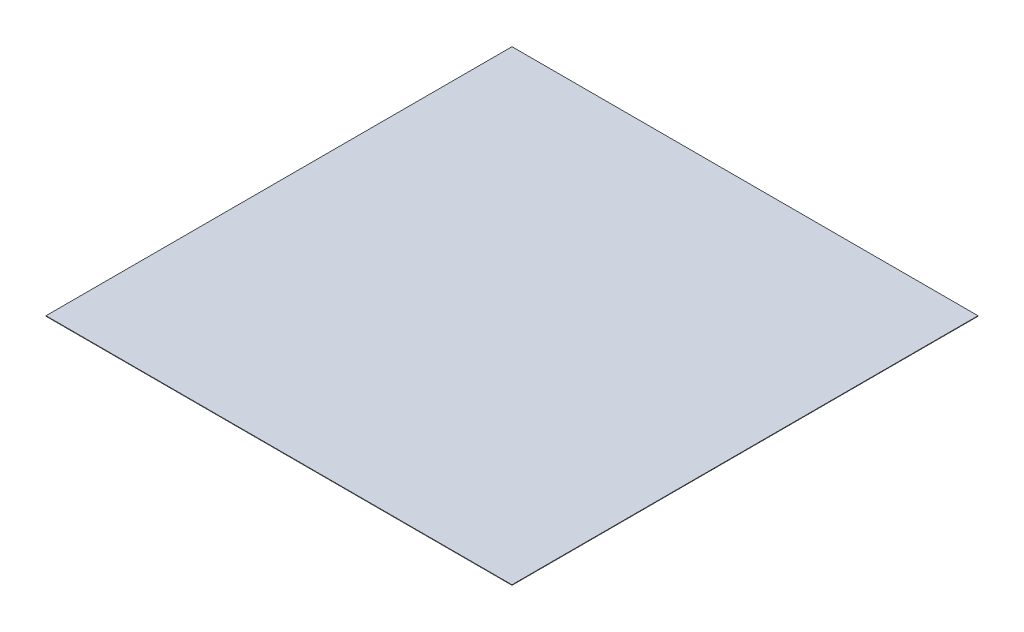
ISO-10303-21;
HEADER;
FILE_DESCRIPTION(('STEP AP214'),'2;1');
FILE_NAME('part.step','',(''),(''),'','','');
FILE_SCHEMA(('AUTOMOTIVE_DESIGN { 1 0 10303 214 1 1 1 1 }'));
ENDSEC;
DATA;
#1=APPLICATION_CONTEXT('core data for automotive mechanical design processes');
#2=APPLICATION_PROTOCOL_DEFINITION('international standard','automotive_design',2000,#1);
#3=PRODUCT_CONTEXT('',#1,'mechanical');
#4=PRODUCT('Part','Part','',(#3));
#5=PRODUCT_RELATED_PRODUCT_CATEGORY('part','',(#4));
#6=PRODUCT_DEFINITION_FORMATION('','',#4);
#7=PRODUCT_DEFINITION_CONTEXT('part definition',#1,'design');
#8=PRODUCT_DEFINITION('design','',#6,#7);
#9=PRODUCT_DEFINITION_SHAPE('','',#8);
#10=(LENGTH_UNIT() NAMED_UNIT(*) SI_UNIT(.MILLI.,.METRE.));
#11=(NAMED_UNIT(*) PLANE_ANGLE_UNIT() SI_UNIT($,.RADIAN.));
#12=(NAMED_UNIT(*) SI_UNIT($,.STERADIAN.) SOLID_ANGLE_UNIT());
#13=UNCERTAINTY_MEASURE_WITH_UNIT(LENGTH_MEASURE(1.E-05),#10,'distance_accuracy_value','');
#14=(GEOMETRIC_REPRESENTATION_CONTEXT(3) GLOBAL_UNCERTAINTY_ASSIGNED_CONTEXT((#13)) GLOBAL_UNIT_ASSIGNED_CONTEXT((#10,
#11,#12)) REPRESENTATION_CONTEXT('',''));
#15=CARTESIAN_POINT('',(0.,0.,0.));
#16=DIRECTION('',(0.,0.,1.));
#17=DIRECTION('',(1.,0.,0.));
#18=AXIS2_PLACEMENT_3D('',#15,#16,#17);
#19=CARTESIAN_POINT('',(620.,1.27,620.));
#20=DIRECTION('',(-1.,0.,0.));
#21=DIRECTION('',(0.,0.,1.));
#22=AXIS2_PLACEMENT_3D('',#19,#20,#21);
#23=PLANE('',#22);
#24=DIRECTION('',(0.,0.,-1.));
#25=VECTOR('',#24,1.);
#26=CARTESIAN_POINT('',(620.,0.,620.));
#27=LINE('',#26,#25);
#28=CARTESIAN_POINT('',(620.,0.,620.));
#29=VERTEX_POINT('',#28);
#30=CARTESIAN_POINT('',(620.,0.,-620.));
#31=VERTEX_POINT('',#30);
#32=EDGE_CURVE('E98',#29,#31,#27,.T.);
#33=ORIENTED_EDGE('',*,*,#32,.T.);
#34=DIRECTION('',(0.,-1.,0.));
#35=VECTOR('',#34,1.);
#36=CARTESIAN_POINT('',(620.,1.27,-620.));
#37=LINE('',#36,#35);
#38=CARTESIAN_POINT('',(620.,1.27,-620.));
#39=VERTEX_POINT('',#38);
#40=EDGE_CURVE('E11',#39,#31,#37,.T.);
#41=ORIENTED_EDGE('',*,*,#40,.F.);
#42=DIRECTION('',(0.,0.,-1.));
#43=VECTOR('',#42,1.);
#44=CARTESIAN_POINT('',(620.,1.27,620.));
#45=LINE('',#44,#43);
#46=CARTESIAN_POINT('',(620.,1.27,620.));
#47=VERTEX_POINT('',#46);
#48=EDGE_CURVE('E86',#47,#39,#45,.T.);
#49=ORIENTED_EDGE('',*,*,#48,.F.);
#50=DIRECTION('',(0.,-1.,0.));
#51=VECTOR('',#50,1.);
#52=CARTESIAN_POINT('',(620.,1.27,620.));
#53=LINE('',#52,#51);
#54=EDGE_CURVE('E94',#47,#29,#53,.T.);
#55=ORIENTED_EDGE('',*,*,#54,.T.);
#56=EDGE_LOOP('',(#33,#41,#49,#55));
#57=FACE_BOUND('',#56,.T.);
#58=ADVANCED_FACE('F35',(#57),#23,.F.);
#59=CARTESIAN_POINT('',(-620.,1.27,-620.));
#60=DIRECTION('',(0.,0.,1.));
#61=DIRECTION('',(1.,0.,0.));
#62=AXIS2_PLACEMENT_3D('',#59,#60,#61);
#63=PLANE('',#62);
#64=DIRECTION('',(-1.,0.,0.));
#65=VECTOR('',#64,1.);
#66=CARTESIAN_POINT('',(-620.,0.,-620.));
#67=LINE('',#66,#65);
#68=CARTESIAN_POINT('',(-620.,0.,-620.));
#69=VERTEX_POINT('',#68);
#70=EDGE_CURVE('E90',#31,#69,#67,.T.);
#71=ORIENTED_EDGE('',*,*,#70,.T.);
#72=DIRECTION('',(0.,-1.,0.));
#73=VECTOR('',#72,1.);
#74=CARTESIAN_POINT('',(-620.,1.27,-620.));
#75=LINE('',#74,#73);
#76=CARTESIAN_POINT('',(-620.,1.27,-620.));
#77=VERTEX_POINT('',#76);
#78=EDGE_CURVE('E43',#77,#69,#75,.T.);
#79=ORIENTED_EDGE('',*,*,#78,.F.);
#80=DIRECTION('',(-1.,0.,0.));
#81=VECTOR('',#80,1.);
#82=CARTESIAN_POINT('',(-620.,1.27,-620.));
#83=LINE('',#82,#81);
#84=EDGE_CURVE('E81',#39,#77,#83,.T.);
#85=ORIENTED_EDGE('',*,*,#84,.F.);
#86=ORIENTED_EDGE('',*,*,#40,.T.);
#87=EDGE_LOOP('',(#71,#79,#85,#86));
#88=FACE_BOUND('',#87,.T.);
#89=ADVANCED_FACE('F89',(#88),#63,.F.);
#90=CARTESIAN_POINT('',(-620.,1.27,620.));
#91=DIRECTION('',(1.,0.,0.));
#92=DIRECTION('',(0.,0.,-1.));
#93=AXIS2_PLACEMENT_3D('',#90,#91,#92);
#94=PLANE('',#93);
#95=DIRECTION('',(0.,0.,1.));
#96=VECTOR('',#95,1.);
#97=CARTESIAN_POINT('',(-620.,0.,620.));
#98=LINE('',#97,#96);
#99=CARTESIAN_POINT('',(-620.,0.,620.));
#100=VERTEX_POINT('',#99);
#101=EDGE_CURVE('E68',#69,#100,#98,.T.);
#102=ORIENTED_EDGE('',*,*,#101,.T.);
#103=DIRECTION('',(0.,-1.,0.));
#104=VECTOR('',#103,1.);
#105=CARTESIAN_POINT('',(-620.,1.27,620.));
#106=LINE('',#105,#104);
#107=CARTESIAN_POINT('',(-620.,1.27,620.));
#108=VERTEX_POINT('',#107);
#109=EDGE_CURVE('E91',#108,#100,#106,.T.);
#110=ORIENTED_EDGE('',*,*,#109,.F.);
#111=DIRECTION('',(0.,0.,1.));
#112=VECTOR('',#111,1.);
#113=CARTESIAN_POINT('',(-620.,1.27,620.));
#114=LINE('',#113,#112);
#115=EDGE_CURVE('E84',#77,#108,#114,.T.);
#116=ORIENTED_EDGE('',*,*,#115,.F.);
#117=ORIENTED_EDGE('',*,*,#78,.T.);
#118=EDGE_LOOP('',(#102,#110,#116,#117));
#119=FACE_BOUND('',#118,.T.);
#120=ADVANCED_FACE('F92',(#119),#94,.F.);
#121=CARTESIAN_POINT('',(-620.,1.27,620.));
#122=DIRECTION('',(0.,0.,-1.));
#123=DIRECTION('',(-1.,0.,0.));
#124=AXIS2_PLACEMENT_3D('',#121,#122,#123);
#125=PLANE('',#124);
#126=DIRECTION('',(1.,0.,0.));
#127=VECTOR('',#126,1.);
#128=CARTESIAN_POINT('',(-620.,0.,620.));
#129=LINE('',#128,#127);
#130=EDGE_CURVE('E74',#100,#29,#129,.T.);
#131=ORIENTED_EDGE('',*,*,#130,.T.);
#132=ORIENTED_EDGE('',*,*,#54,.F.);
#133=DIRECTION('',(1.,0.,0.));
#134=VECTOR('',#133,1.);
#135=CARTESIAN_POINT('',(-620.,1.27,620.));
#136=LINE('',#135,#134);
#137=EDGE_CURVE('E51',#108,#47,#136,.T.);
#138=ORIENTED_EDGE('',*,*,#137,.F.);
#139=ORIENTED_EDGE('',*,*,#109,.T.);
#140=EDGE_LOOP('',(#131,#132,#138,#139));
#141=FACE_BOUND('',#140,.T.);
#142=ADVANCED_FACE('F105',(#141),#125,.F.);
#143=CARTESIAN_POINT('',(0.,1.27,0.));
#144=DIRECTION('',(0.,-1.,0.));
#145=DIRECTION('',(0.,0.,-1.));
#146=AXIS2_PLACEMENT_3D('',#143,#144,#145);
#147=PLANE('',#146);
#148=ORIENTED_EDGE('',*,*,#48,.T.);
#149=ORIENTED_EDGE('',*,*,#84,.T.);
#150=ORIENTED_EDGE('',*,*,#115,.T.);
#151=ORIENTED_EDGE('',*,*,#137,.T.);
#152=EDGE_LOOP('',(#148,#149,#150,#151));
#153=FACE_BOUND('',#152,.T.);
#154=ADVANCED_FACE('F82',(#153),#147,.F.);
#155=CARTESIAN_POINT('',(0.,0.,0.));
#156=DIRECTION('',(0.,-1.,0.));
#157=DIRECTION('',(0.,0.,-1.));
#158=AXIS2_PLACEMENT_3D('',#155,#156,#157);
#159=PLANE('',#158);
#160=ORIENTED_EDGE('',*,*,#32,.F.);
#161=ORIENTED_EDGE('',*,*,#130,.F.);
#162=ORIENTED_EDGE('',*,*,#101,.F.);
#163=ORIENTED_EDGE('',*,*,#70,.F.);
#164=EDGE_LOOP('',(#160,#161,#162,#163));
#165=FACE_BOUND('',#164,.T.);
#166=ADVANCED_FACE('F108',(#165),#159,.T.);
#167=CLOSED_SHELL('',(#58,#89,#120,#142,#154,#166));
#168=MANIFOLD_SOLID_BREP('B2',#167);
#169=ADVANCED_BREP_SHAPE_REPRESENTATION('',(#18,#168),#14);
#170=SHAPE_DEFINITION_REPRESENTATION(#9,#169);
ENDSEC;
END-ISO-10303-21;
